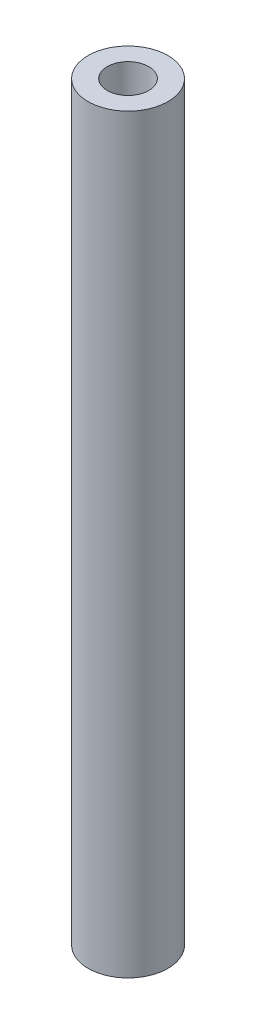
ISO-10303-21;
HEADER;
FILE_DESCRIPTION(('STEP AP214'),'2;1');
FILE_NAME('part.step','',(''),(''),'','','');
FILE_SCHEMA(('AUTOMOTIVE_DESIGN { 1 0 10303 214 1 1 1 1 }'));
ENDSEC;
DATA;
#1=APPLICATION_CONTEXT('core data for automotive mechanical design processes');
#2=APPLICATION_PROTOCOL_DEFINITION('international standard','automotive_design',2000,#1);
#3=PRODUCT_CONTEXT('',#1,'mechanical');
#4=PRODUCT('Part','Part','',(#3));
#5=PRODUCT_RELATED_PRODUCT_CATEGORY('part','',(#4));
#6=PRODUCT_DEFINITION_FORMATION('','',#4);
#7=PRODUCT_DEFINITION_CONTEXT('part definition',#1,'design');
#8=PRODUCT_DEFINITION('design','',#6,#7);
#9=PRODUCT_DEFINITION_SHAPE('','',#8);
#10=(LENGTH_UNIT() NAMED_UNIT(*) SI_UNIT(.MILLI.,.METRE.));
#11=(NAMED_UNIT(*) PLANE_ANGLE_UNIT() SI_UNIT($,.RADIAN.));
#12=(NAMED_UNIT(*) SI_UNIT($,.STERADIAN.) SOLID_ANGLE_UNIT());
#13=UNCERTAINTY_MEASURE_WITH_UNIT(LENGTH_MEASURE(1.E-05),#10,'distance_accuracy_value','');
#14=(GEOMETRIC_REPRESENTATION_CONTEXT(3) GLOBAL_UNCERTAINTY_ASSIGNED_CONTEXT((#13)) GLOBAL_UNIT_ASSIGNED_CONTEXT((#10,
#11,#12)) REPRESENTATION_CONTEXT('',''));
#15=CARTESIAN_POINT('',(0.,0.,0.));
#16=DIRECTION('',(0.,0.,1.));
#17=DIRECTION('',(1.,0.,0.));
#18=AXIS2_PLACEMENT_3D('',#15,#16,#17);
#19=CARTESIAN_POINT('',(0.,117.5,0.));
#20=DIRECTION('',(0.,1.,0.));
#21=DIRECTION('',(0.,0.,1.));
#22=AXIS2_PLACEMENT_3D('',#19,#20,#21);
#23=PLANE('',#22);
#24=CARTESIAN_POINT('',(0.,117.5,0.));
#25=DIRECTION('',(0.,1.,0.));
#26=DIRECTION('',(0.,0.,1.));
#27=AXIS2_PLACEMENT_3D('',#24,#25,#26);
#28=CIRCLE('',#27,6.25);
#29=CARTESIAN_POINT('',(0.,117.5,-6.25));
#30=VERTEX_POINT('',#29);
#31=EDGE_CURVE('E11',#30,#30,#28,.T.);
#32=ORIENTED_EDGE('',*,*,#31,.T.);
#33=EDGE_LOOP('',(#32));
#34=FACE_BOUND('',#33,.T.);
#35=CARTESIAN_POINT('',(0.,117.5,0.));
#36=DIRECTION('',(0.,1.,0.));
#37=DIRECTION('',(0.,0.,1.));
#38=AXIS2_PLACEMENT_3D('',#35,#36,#37);
#39=CIRCLE('',#38,3.25);
#40=CARTESIAN_POINT('',(0.,117.5,-3.25));
#41=VERTEX_POINT('',#40);
#42=EDGE_CURVE('E53',#41,#41,#39,.T.);
#43=ORIENTED_EDGE('',*,*,#42,.F.);
#44=EDGE_LOOP('',(#43));
#45=FACE_BOUND('',#44,.T.);
#46=ADVANCED_FACE('F42',(#34,#45),#23,.T.);
#47=CARTESIAN_POINT('',(0.,0.,0.));
#48=DIRECTION('',(0.,1.,0.));
#49=DIRECTION('',(0.,0.,1.));
#50=AXIS2_PLACEMENT_3D('',#47,#48,#49);
#51=PLANE('',#50);
#52=CARTESIAN_POINT('',(0.,0.,0.));
#53=DIRECTION('',(0.,1.,0.));
#54=DIRECTION('',(0.,0.,1.));
#55=AXIS2_PLACEMENT_3D('',#52,#53,#54);
#56=CIRCLE('',#55,6.25);
#57=CARTESIAN_POINT('',(0.,0.,-6.25));
#58=VERTEX_POINT('',#57);
#59=EDGE_CURVE('E46',#58,#58,#56,.T.);
#60=ORIENTED_EDGE('',*,*,#59,.F.);
#61=EDGE_LOOP('',(#60));
#62=FACE_BOUND('',#61,.T.);
#63=CARTESIAN_POINT('',(0.,0.,0.));
#64=DIRECTION('',(0.,1.,0.));
#65=DIRECTION('',(0.,0.,1.));
#66=AXIS2_PLACEMENT_3D('',#63,#64,#65);
#67=CIRCLE('',#66,3.25);
#68=CARTESIAN_POINT('',(0.,0.,-3.25));
#69=VERTEX_POINT('',#68);
#70=EDGE_CURVE('E55',#69,#69,#67,.T.);
#71=ORIENTED_EDGE('',*,*,#70,.T.);
#72=EDGE_LOOP('',(#71));
#73=FACE_BOUND('',#72,.T.);
#74=ADVANCED_FACE('F65',(#62,#73),#51,.F.);
#75=CARTESIAN_POINT('',(0.,117.5,0.));
#76=DIRECTION('',(0.,-1.,0.));
#77=DIRECTION('',(0.,0.,-1.));
#78=AXIS2_PLACEMENT_3D('',#75,#76,#77);
#79=CYLINDRICAL_SURFACE('',#78,6.25);
#80=CARTESIAN_POINT('',(0.,117.5,-6.25));
#81=CARTESIAN_POINT('',(0.,116.276041666667,-6.25));
#82=CARTESIAN_POINT('',(0.,115.052083333333,-6.25));
#83=CARTESIAN_POINT('',(0.,112.604166666667,-6.25));
#84=CARTESIAN_POINT('',(0.,111.380208333333,-6.25));
#85=CARTESIAN_POINT('',(0.,108.932291666667,-6.25));
#86=CARTESIAN_POINT('',(0.,107.708333333333,-6.25));
#87=CARTESIAN_POINT('',(0.,105.260416666667,-6.25));
#88=CARTESIAN_POINT('',(0.,104.036458333333,-6.25));
#89=CARTESIAN_POINT('',(0.,101.588541666667,-6.25));
#90=CARTESIAN_POINT('',(0.,100.364583333333,-6.25));
#91=CARTESIAN_POINT('',(0.,97.9166666666667,-6.25));
#92=CARTESIAN_POINT('',(0.,96.6927083333333,-6.25));
#93=CARTESIAN_POINT('',(0.,94.2447916666667,-6.25));
#94=CARTESIAN_POINT('',(0.,93.0208333333333,-6.25));
#95=CARTESIAN_POINT('',(0.,90.5729166666667,-6.25));
#96=CARTESIAN_POINT('',(0.,89.3489583333333,-6.25));
#97=CARTESIAN_POINT('',(0.,86.9010416666667,-6.25));
#98=CARTESIAN_POINT('',(0.,85.6770833333333,-6.25));
#99=CARTESIAN_POINT('',(0.,83.2291666666667,-6.25));
#100=CARTESIAN_POINT('',(0.,82.0052083333333,-6.25));
#101=CARTESIAN_POINT('',(0.,79.5572916666667,-6.25));
#102=CARTESIAN_POINT('',(0.,78.3333333333333,-6.25));
#103=CARTESIAN_POINT('',(0.,75.8854166666667,-6.25));
#104=CARTESIAN_POINT('',(0.,74.6614583333333,-6.25));
#105=CARTESIAN_POINT('',(0.,72.2135416666667,-6.25));
#106=CARTESIAN_POINT('',(0.,70.9895833333333,-6.25));
#107=CARTESIAN_POINT('',(0.,68.5416666666667,-6.25));
#108=CARTESIAN_POINT('',(0.,67.3177083333333,-6.25));
#109=CARTESIAN_POINT('',(0.,64.8697916666667,-6.25));
#110=CARTESIAN_POINT('',(0.,63.6458333333333,-6.25));
#111=CARTESIAN_POINT('',(0.,61.1979166666667,-6.25));
#112=CARTESIAN_POINT('',(0.,59.9739583333333,-6.25));
#113=CARTESIAN_POINT('',(0.,57.5260416666667,-6.25));
#114=CARTESIAN_POINT('',(0.,56.3020833333333,-6.25));
#115=CARTESIAN_POINT('',(0.,53.8541666666667,-6.25));
#116=CARTESIAN_POINT('',(0.,52.6302083333333,-6.25));
#117=CARTESIAN_POINT('',(0.,50.1822916666667,-6.25));
#118=CARTESIAN_POINT('',(0.,48.9583333333333,-6.25));
#119=CARTESIAN_POINT('',(0.,46.5104166666667,-6.25));
#120=CARTESIAN_POINT('',(0.,45.2864583333333,-6.25));
#121=CARTESIAN_POINT('',(0.,42.8385416666667,-6.25));
#122=CARTESIAN_POINT('',(0.,41.6145833333333,-6.25));
#123=CARTESIAN_POINT('',(0.,39.1666666666667,-6.25));
#124=CARTESIAN_POINT('',(0.,37.9427083333333,-6.25));
#125=CARTESIAN_POINT('',(0.,35.4947916666667,-6.25));
#126=CARTESIAN_POINT('',(0.,34.2708333333333,-6.25));
#127=CARTESIAN_POINT('',(0.,31.8229166666667,-6.25));
#128=CARTESIAN_POINT('',(0.,30.5989583333333,-6.25));
#129=CARTESIAN_POINT('',(0.,28.1510416666667,-6.25));
#130=CARTESIAN_POINT('',(0.,26.9270833333333,-6.25));
#131=CARTESIAN_POINT('',(0.,24.4791666666667,-6.25));
#132=CARTESIAN_POINT('',(0.,23.2552083333333,-6.25));
#133=CARTESIAN_POINT('',(0.,20.8072916666667,-6.25));
#134=CARTESIAN_POINT('',(0.,19.5833333333333,-6.25));
#135=CARTESIAN_POINT('',(0.,17.1354166666667,-6.25));
#136=CARTESIAN_POINT('',(0.,15.9114583333333,-6.25));
#137=CARTESIAN_POINT('',(0.,13.4635416666667,-6.25));
#138=CARTESIAN_POINT('',(0.,12.2395833333333,-6.25));
#139=CARTESIAN_POINT('',(0.,9.79166666666665,-6.25));
#140=CARTESIAN_POINT('',(0.,8.56770833333332,-6.25));
#141=CARTESIAN_POINT('',(0.,6.11979166666665,-6.25));
#142=CARTESIAN_POINT('',(0.,4.89583333333332,-6.25));
#143=CARTESIAN_POINT('',(0.,2.44791666666666,-6.25));
#144=CARTESIAN_POINT('',(0.,1.22395833333332,-6.25));
#145=CARTESIAN_POINT('',(0.,0.,-6.25));
#146=B_SPLINE_CURVE_WITH_KNOTS('',3,(#80,#81,#82,#83,#84,#85,#86,#87,#88,#89,#90,#91,#92,#93,
#94,#95,#96,#97,#98,#99,#100,#101,#102,#103,#104,#105,#106,#107,#108,#109,#110,#111,#112,#113,
#114,#115,#116,#117,#118,#119,#120,#121,#122,#123,#124,#125,#126,#127,#128,#129,#130,#131,#132,
#133,#134,#135,#136,#137,#138,#139,#140,#141,#142,#143,#144,#145),.UNSPECIFIED.,.F.,.F.,(4,2,2,
2,2,2,2,2,2,2,2,2,2,2,2,2,2,2,2,2,2,2,2,2,2,2,2,2,2,2,2,2,4),(0.,3.67187499999999,7.34375,
11.015625,14.6875,18.359375,22.03125,25.703125,29.375,33.046875,36.71875,40.390625,44.0625,
47.734375,51.40625,55.078125,58.75,62.421875,66.09375,69.765625,73.4375,77.109375,80.78125,
84.453125,88.125,91.796875,95.46875,99.140625,102.8125,106.484375,110.15625,113.828125,117.5),.UNSPECIFIED.);
#147=EDGE_CURVE('BSEAM44',#30,#58,#146,.T.);
#148=ORIENTED_EDGE('',*,*,#31,.F.);
#149=ORIENTED_EDGE('',*,*,#59,.T.);
#150=ORIENTED_EDGE('',*,*,#147,.T.);
#151=ORIENTED_EDGE('',*,*,#147,.F.);
#152=EDGE_LOOP('',(#148,#150,#149,#151));
#153=FACE_BOUND('',#152,.T.);
#154=ADVANCED_FACE('F44',(#153),#79,.T.);
#155=CARTESIAN_POINT('',(0.,117.5,0.));
#156=DIRECTION('',(0.,-1.,0.));
#157=DIRECTION('',(0.,0.,-1.));
#158=AXIS2_PLACEMENT_3D('',#155,#156,#157);
#159=CYLINDRICAL_SURFACE('',#158,3.25);
#160=CARTESIAN_POINT('',(0.,117.5,-3.25));
#161=CARTESIAN_POINT('',(0.,116.276041666667,-3.25));
#162=CARTESIAN_POINT('',(0.,115.052083333333,-3.25));
#163=CARTESIAN_POINT('',(0.,112.604166666667,-3.25));
#164=CARTESIAN_POINT('',(0.,111.380208333333,-3.25));
#165=CARTESIAN_POINT('',(0.,108.932291666667,-3.25));
#166=CARTESIAN_POINT('',(0.,107.708333333333,-3.25));
#167=CARTESIAN_POINT('',(0.,105.260416666667,-3.25));
#168=CARTESIAN_POINT('',(0.,104.036458333333,-3.25));
#169=CARTESIAN_POINT('',(0.,101.588541666667,-3.25));
#170=CARTESIAN_POINT('',(0.,100.364583333333,-3.25));
#171=CARTESIAN_POINT('',(0.,97.9166666666667,-3.25));
#172=CARTESIAN_POINT('',(0.,96.6927083333333,-3.25));
#173=CARTESIAN_POINT('',(0.,94.2447916666667,-3.25));
#174=CARTESIAN_POINT('',(0.,93.0208333333333,-3.25));
#175=CARTESIAN_POINT('',(0.,90.5729166666667,-3.25));
#176=CARTESIAN_POINT('',(0.,89.3489583333333,-3.25));
#177=CARTESIAN_POINT('',(0.,86.9010416666667,-3.25));
#178=CARTESIAN_POINT('',(0.,85.6770833333333,-3.25));
#179=CARTESIAN_POINT('',(0.,83.2291666666667,-3.25));
#180=CARTESIAN_POINT('',(0.,82.0052083333333,-3.25));
#181=CARTESIAN_POINT('',(0.,79.5572916666667,-3.25));
#182=CARTESIAN_POINT('',(0.,78.3333333333333,-3.25));
#183=CARTESIAN_POINT('',(0.,75.8854166666667,-3.25));
#184=CARTESIAN_POINT('',(0.,74.6614583333333,-3.25));
#185=CARTESIAN_POINT('',(0.,72.2135416666667,-3.25));
#186=CARTESIAN_POINT('',(0.,70.9895833333333,-3.25));
#187=CARTESIAN_POINT('',(0.,68.5416666666667,-3.25));
#188=CARTESIAN_POINT('',(0.,67.3177083333333,-3.25));
#189=CARTESIAN_POINT('',(0.,64.8697916666667,-3.25));
#190=CARTESIAN_POINT('',(0.,63.6458333333333,-3.25));
#191=CARTESIAN_POINT('',(0.,61.1979166666667,-3.25));
#192=CARTESIAN_POINT('',(0.,59.9739583333333,-3.25));
#193=CARTESIAN_POINT('',(0.,57.5260416666667,-3.25));
#194=CARTESIAN_POINT('',(0.,56.3020833333333,-3.25));
#195=CARTESIAN_POINT('',(0.,53.8541666666667,-3.25));
#196=CARTESIAN_POINT('',(0.,52.6302083333333,-3.25));
#197=CARTESIAN_POINT('',(0.,50.1822916666667,-3.25));
#198=CARTESIAN_POINT('',(0.,48.9583333333333,-3.25));
#199=CARTESIAN_POINT('',(0.,46.5104166666667,-3.25));
#200=CARTESIAN_POINT('',(0.,45.2864583333333,-3.25));
#201=CARTESIAN_POINT('',(0.,42.8385416666667,-3.25));
#202=CARTESIAN_POINT('',(0.,41.6145833333333,-3.25));
#203=CARTESIAN_POINT('',(0.,39.1666666666667,-3.25));
#204=CARTESIAN_POINT('',(0.,37.9427083333333,-3.25));
#205=CARTESIAN_POINT('',(0.,35.4947916666667,-3.25));
#206=CARTESIAN_POINT('',(0.,34.2708333333333,-3.25));
#207=CARTESIAN_POINT('',(0.,31.8229166666667,-3.25));
#208=CARTESIAN_POINT('',(0.,30.5989583333333,-3.25));
#209=CARTESIAN_POINT('',(0.,28.1510416666667,-3.25));
#210=CARTESIAN_POINT('',(0.,26.9270833333333,-3.25));
#211=CARTESIAN_POINT('',(0.,24.4791666666667,-3.25));
#212=CARTESIAN_POINT('',(0.,23.2552083333333,-3.25));
#213=CARTESIAN_POINT('',(0.,20.8072916666667,-3.25));
#214=CARTESIAN_POINT('',(0.,19.5833333333333,-3.25));
#215=CARTESIAN_POINT('',(0.,17.1354166666667,-3.25));
#216=CARTESIAN_POINT('',(0.,15.9114583333333,-3.25));
#217=CARTESIAN_POINT('',(0.,13.4635416666667,-3.25));
#218=CARTESIAN_POINT('',(0.,12.2395833333333,-3.25));
#219=CARTESIAN_POINT('',(0.,9.79166666666665,-3.25));
#220=CARTESIAN_POINT('',(0.,8.56770833333332,-3.25));
#221=CARTESIAN_POINT('',(0.,6.11979166666665,-3.25));
#222=CARTESIAN_POINT('',(0.,4.89583333333332,-3.25));
#223=CARTESIAN_POINT('',(0.,2.44791666666666,-3.25));
#224=CARTESIAN_POINT('',(0.,1.22395833333332,-3.25));
#225=CARTESIAN_POINT('',(0.,0.,-3.25));
#226=B_SPLINE_CURVE_WITH_KNOTS('',3,(#160,#161,#162,#163,#164,#165,#166,#167,#168,#169,#170,
#171,#172,#173,#174,#175,#176,#177,#178,#179,#180,#181,#182,#183,#184,#185,#186,#187,#188,#189,
#190,#191,#192,#193,#194,#195,#196,#197,#198,#199,#200,#201,#202,#203,#204,#205,#206,#207,#208,
#209,#210,#211,#212,#213,#214,#215,#216,#217,#218,#219,#220,#221,#222,#223,#224,#225),
.UNSPECIFIED.,.F.,.F.,(4,2,2,2,2,2,2,2,2,2,2,2,2,2,2,2,2,2,2,2,2,2,2,2,2,2,2,2,2,2,2,2,4),(0.,
3.67187499999999,7.34375,11.015625,14.6875,18.359375,22.03125,25.703125,29.375,33.046875,
36.71875,40.390625,44.0625,47.734375,51.40625,55.078125,58.75,62.421875,66.09375,69.765625,
73.4375,77.109375,80.78125,84.453125,88.125,91.796875,95.46875,99.140625,102.8125,106.484375,
110.15625,113.828125,117.5),.UNSPECIFIED.);
#227=EDGE_CURVE('BSEAM61',#41,#69,#226,.T.);
#228=ORIENTED_EDGE('',*,*,#42,.T.);
#229=ORIENTED_EDGE('',*,*,#70,.F.);
#230=ORIENTED_EDGE('',*,*,#227,.T.);
#231=ORIENTED_EDGE('',*,*,#227,.F.);
#232=EDGE_LOOP('',(#228,#230,#229,#231));
#233=FACE_BOUND('',#232,.T.);
#234=ADVANCED_FACE('F61',(#233),#159,.F.);
#235=CLOSED_SHELL('',(#46,#74,#154,#234));
#236=MANIFOLD_SOLID_BREP('B2',#235);
#237=ADVANCED_BREP_SHAPE_REPRESENTATION('',(#18,#236),#14);
#238=SHAPE_DEFINITION_REPRESENTATION(#9,#237);
ENDSEC;
END-ISO-10303-21;
